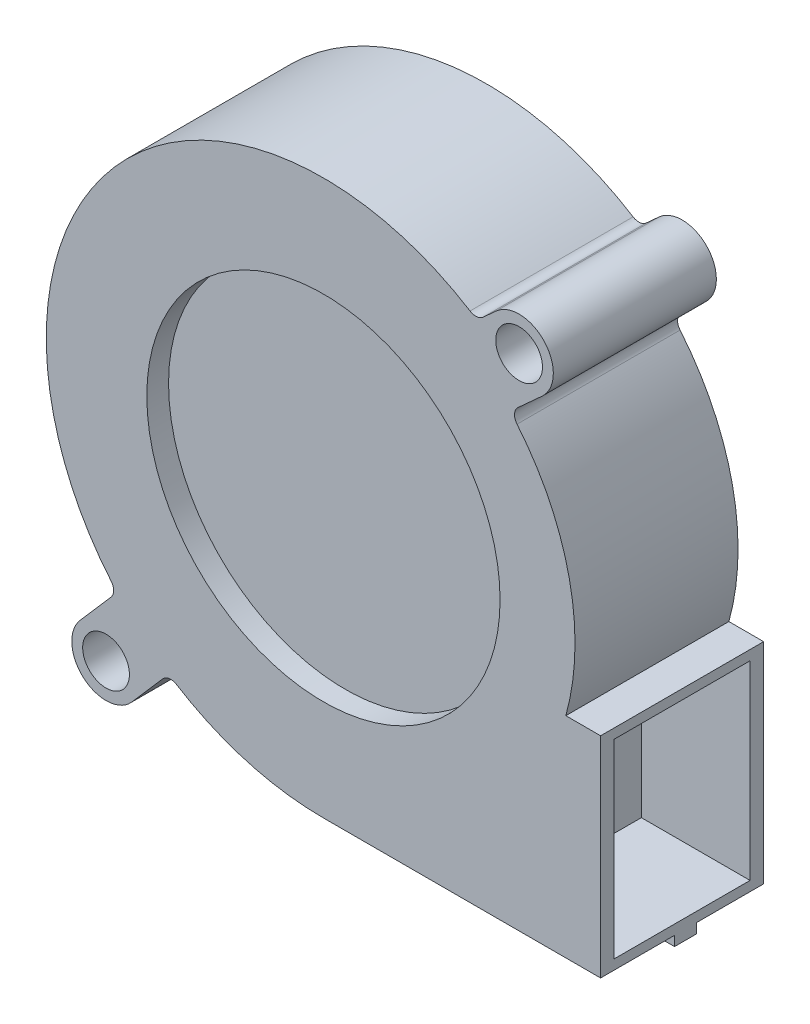
ISO-10303-21;
HEADER;
FILE_DESCRIPTION(('STEP AP214'),'2;1');
FILE_NAME('part.step','',(''),(''),'','','');
FILE_SCHEMA(('AUTOMOTIVE_DESIGN { 1 0 10303 214 1 1 1 1 }'));
ENDSEC;
DATA;
#1=APPLICATION_CONTEXT('core data for automotive mechanical design processes');
#2=APPLICATION_PROTOCOL_DEFINITION('international standard','automotive_design',2000,#1);
#3=PRODUCT_CONTEXT('',#1,'mechanical');
#4=PRODUCT('Part','Part','',(#3));
#5=PRODUCT_RELATED_PRODUCT_CATEGORY('part','',(#4));
#6=PRODUCT_DEFINITION_FORMATION('','',#4);
#7=PRODUCT_DEFINITION_CONTEXT('part definition',#1,'design');
#8=PRODUCT_DEFINITION('design','',#6,#7);
#9=PRODUCT_DEFINITION_SHAPE('','',#8);
#10=(LENGTH_UNIT() NAMED_UNIT(*) SI_UNIT(.MILLI.,.METRE.));
#11=(NAMED_UNIT(*) PLANE_ANGLE_UNIT() SI_UNIT($,.RADIAN.));
#12=(NAMED_UNIT(*) SI_UNIT($,.STERADIAN.) SOLID_ANGLE_UNIT());
#13=UNCERTAINTY_MEASURE_WITH_UNIT(LENGTH_MEASURE(1.E-05),#10,'distance_accuracy_value','');
#14=(GEOMETRIC_REPRESENTATION_CONTEXT(3) GLOBAL_UNCERTAINTY_ASSIGNED_CONTEXT((#13)) GLOBAL_UNIT_ASSIGNED_CONTEXT((#10,
#11,#12)) REPRESENTATION_CONTEXT('',''));
#15=CARTESIAN_POINT('',(0.,0.,0.));
#16=DIRECTION('',(0.,0.,1.));
#17=DIRECTION('',(1.,0.,0.));
#18=AXIS2_PLACEMENT_3D('',#15,#16,#17);
#19=CARTESIAN_POINT('',(-4.17823720879433,4.59639564959305,7.5));
#20=DIRECTION('',(0.67264597252616,-0.739964455662795,0.));
#21=DIRECTION('',(0.739964455662795,0.67264597252616,0.));
#22=AXIS2_PLACEMENT_3D('',#19,#20,#21);
#23=PLANE('',#22);
#24=DIRECTION('',(-0.739964455662795,-0.67264597252616,0.));
#25=VECTOR('',#24,1.);
#26=CARTESIAN_POINT('',(-4.17823720879433,4.59639564959305,-7.5));
#27=LINE('',#26,#25);
#28=CARTESIAN_POINT('',(15.8811651865426,22.8308880353378,-7.5));
#29=VERTEX_POINT('',#28);
#30=CARTESIAN_POINT('',(14.6907431403997,21.7487649835931,-7.5));
#31=VERTEX_POINT('',#30);
#32=EDGE_CURVE('E261',#29,#31,#27,.T.);
#33=ORIENTED_EDGE('',*,*,#32,.T.);
#34=DIRECTION('',(0.,0.,-1.));
#35=VECTOR('',#34,1.);
#36=CARTESIAN_POINT('',(14.6907431403997,21.7487649835931,7.5));
#37=LINE('',#36,#35);
#38=CARTESIAN_POINT('',(14.6907431403997,21.7487649835931,7.5));
#39=VERTEX_POINT('',#38);
#40=EDGE_CURVE('E11',#39,#31,#37,.T.);
#41=ORIENTED_EDGE('',*,*,#40,.F.);
#42=DIRECTION('',(-0.739964455662795,-0.67264597252616,0.));
#43=VECTOR('',#42,1.);
#44=CARTESIAN_POINT('',(-4.17823720879433,4.59639564959305,7.5));
#45=LINE('',#44,#43);
#46=CARTESIAN_POINT('',(15.8811651865426,22.8308880353378,7.5));
#47=VERTEX_POINT('',#46);
#48=EDGE_CURVE('E267',#47,#39,#45,.T.);
#49=ORIENTED_EDGE('',*,*,#48,.F.);
#50=DIRECTION('',(0.,0.,-1.));
#51=VECTOR('',#50,1.);
#52=CARTESIAN_POINT('',(15.8811651865426,22.8308880353378,7.5));
#53=LINE('',#52,#51);
#54=EDGE_CURVE('E310',#47,#29,#53,.T.);
#55=ORIENTED_EDGE('',*,*,#54,.T.);
#56=EDGE_LOOP('',(#33,#41,#49,#55));
#57=FACE_BOUND('',#56,.T.);
#58=ADVANCED_FACE('F35',(#57),#23,.F.);
#59=CARTESIAN_POINT('',(14.0180971678735,22.4887294392559,7.5));
#60=DIRECTION('',(0.,0.,-1.));
#61=DIRECTION('',(-1.,0.,0.));
#62=AXIS2_PLACEMENT_3D('',#59,#60,#61);
#63=CYLINDRICAL_SURFACE('',#62,0.999999999999999);
#64=CARTESIAN_POINT('',(14.0180971678735,22.4887294392559,-7.5));
#65=DIRECTION('',(0.,0.,1.));
#66=DIRECTION('',(1.,0.,0.));
#67=AXIS2_PLACEMENT_3D('',#64,#65,#66);
#68=CIRCLE('',#67,0.999999999999999);
#69=CARTESIAN_POINT('',(13.4891123690858,21.6400981396614,-7.5));
#70=VERTEX_POINT('',#69);
#71=EDGE_CURVE('E313',#31,#70,#68,.F.);
#72=ORIENTED_EDGE('',*,*,#71,.T.);
#73=DIRECTION('',(0.,0.,-1.));
#74=VECTOR('',#73,1.);
#75=CARTESIAN_POINT('',(13.4891123690858,21.6400981396614,7.5));
#76=LINE('',#75,#74);
#77=CARTESIAN_POINT('',(13.4891123690858,21.6400981396614,7.5));
#78=VERTEX_POINT('',#77);
#79=EDGE_CURVE('E42',#78,#70,#76,.T.);
#80=ORIENTED_EDGE('',*,*,#79,.F.);
#81=CARTESIAN_POINT('',(14.0180971678735,22.4887294392559,7.5));
#82=DIRECTION('',(0.,0.,1.));
#83=DIRECTION('',(1.,0.,0.));
#84=AXIS2_PLACEMENT_3D('',#81,#82,#83);
#85=CIRCLE('',#84,0.999999999999999);
#86=EDGE_CURVE('E270',#39,#78,#85,.F.);
#87=ORIENTED_EDGE('',*,*,#86,.F.);
#88=ORIENTED_EDGE('',*,*,#40,.T.);
#89=EDGE_LOOP('',(#72,#80,#87,#88));
#90=FACE_BOUND('',#89,.T.);
#91=ADVANCED_FACE('F415',(#90),#63,.F.);
#92=CARTESIAN_POINT('',(0.,0.,7.5));
#93=DIRECTION('',(0.,0.,-1.));
#94=DIRECTION('',(-1.,0.,0.));
#95=AXIS2_PLACEMENT_3D('',#92,#93,#94);
#96=CYLINDRICAL_SURFACE('',#95,25.5);
#97=CARTESIAN_POINT('',(0.,0.,-7.5));
#98=DIRECTION('',(0.,0.,1.));
#99=DIRECTION('',(1.,0.,0.));
#100=AXIS2_PLACEMENT_3D('',#97,#98,#99);
#101=CIRCLE('',#100,25.5);
#102=CARTESIAN_POINT('',(-19.5395415831544,-16.3846365452573,-7.5));
#103=VERTEX_POINT('',#102);
#104=EDGE_CURVE('E315',#70,#103,#101,.T.);
#105=ORIENTED_EDGE('',*,*,#104,.T.);
#106=DIRECTION('',(0.,0.,-1.));
#107=VECTOR('',#106,1.);
#108=CARTESIAN_POINT('',(-19.5395415831544,-16.3846365452573,7.5));
#109=LINE('',#108,#107);
#110=CARTESIAN_POINT('',(-19.5395415831544,-16.3846365452573,7.5));
#111=VERTEX_POINT('',#110);
#112=EDGE_CURVE('E388',#111,#103,#109,.T.);
#113=ORIENTED_EDGE('',*,*,#112,.F.);
#114=CARTESIAN_POINT('',(0.,0.,7.5));
#115=DIRECTION('',(0.,0.,1.));
#116=DIRECTION('',(1.,0.,0.));
#117=AXIS2_PLACEMENT_3D('',#114,#115,#116);
#118=CIRCLE('',#117,25.5);
#119=EDGE_CURVE('E273',#78,#111,#118,.T.);
#120=ORIENTED_EDGE('',*,*,#119,.F.);
#121=ORIENTED_EDGE('',*,*,#79,.T.);
#122=EDGE_LOOP('',(#105,#113,#120,#121));
#123=FACE_BOUND('',#122,.T.);
#124=ADVANCED_FACE('F395',(#123),#96,.T.);
#125=CARTESIAN_POINT('',(-20.3057981158271,-17.027171311738,7.5));
#126=DIRECTION('',(0.,0.,-1.));
#127=DIRECTION('',(-1.,0.,0.));
#128=AXIS2_PLACEMENT_3D('',#125,#126,#127);
#129=CYLINDRICAL_SURFACE('',#128,0.999999999999999);
#130=CARTESIAN_POINT('',(-20.3057981158271,-17.027171311738,-7.5));
#131=DIRECTION('',(0.,0.,1.));
#132=DIRECTION('',(1.,0.,0.));
#133=AXIS2_PLACEMENT_3D('',#130,#131,#132);
#134=CIRCLE('',#133,0.999999999999999);
#135=CARTESIAN_POINT('',(-19.5511925936636,-17.6833500266628,-7.5));
#136=VERTEX_POINT('',#135);
#137=EDGE_CURVE('E317',#103,#136,#134,.F.);
#138=ORIENTED_EDGE('',*,*,#137,.T.);
#139=DIRECTION('',(0.,0.,-1.));
#140=VECTOR('',#139,1.);
#141=CARTESIAN_POINT('',(-19.5511925936636,-17.6833500266628,7.5));
#142=LINE('',#141,#140);
#143=CARTESIAN_POINT('',(-19.5511925936636,-17.6833500266628,7.5));
#144=VERTEX_POINT('',#143);
#145=EDGE_CURVE('E386',#144,#136,#142,.T.);
#146=ORIENTED_EDGE('',*,*,#145,.F.);
#147=CARTESIAN_POINT('',(-20.3057981158271,-17.027171311738,7.5));
#148=DIRECTION('',(0.,0.,1.));
#149=DIRECTION('',(1.,0.,0.));
#150=AXIS2_PLACEMENT_3D('',#147,#148,#149);
#151=CIRCLE('',#150,0.999999999999999);
#152=EDGE_CURVE('E275',#111,#144,#151,.F.);
#153=ORIENTED_EDGE('',*,*,#152,.F.);
#154=ORIENTED_EDGE('',*,*,#112,.T.);
#155=EDGE_LOOP('',(#138,#146,#153,#154));
#156=FACE_BOUND('',#155,.T.);
#157=ADVANCED_FACE('F407',(#156),#129,.F.);
#158=CARTESIAN_POINT('',(-2.377007394815,2.06696295201305,7.5));
#159=DIRECTION('',(-0.754605522163504,0.656178714924788,0.));
#160=DIRECTION('',(-0.656178714924788,-0.754605522163504,0.));
#161=AXIS2_PLACEMENT_3D('',#158,#159,#160);
#162=PLANE('',#161);
#163=DIRECTION('',(0.656178714924788,0.754605522163504,0.));
#164=VECTOR('',#163,1.);
#165=CARTESIAN_POINT('',(-2.377007394815,2.06696295201305,-7.5));
#166=LINE('',#165,#164);
#167=CARTESIAN_POINT('',(-22.377007394815,-20.9330370479869,-7.5));
#168=VERTEX_POINT('',#167);
#169=EDGE_CURVE('E320',#168,#136,#166,.T.);
#170=ORIENTED_EDGE('',*,*,#169,.F.);
#171=DIRECTION('',(0.,0.,-1.));
#172=VECTOR('',#171,1.);
#173=CARTESIAN_POINT('',(-22.377007394815,-20.9330370479869,7.5));
#174=LINE('',#173,#172);
#175=CARTESIAN_POINT('',(-22.377007394815,-20.9330370479869,7.5));
#176=VERTEX_POINT('',#175);
#177=EDGE_CURVE('E384',#176,#168,#174,.T.);
#178=ORIENTED_EDGE('',*,*,#177,.F.);
#179=DIRECTION('',(0.656178714924788,0.754605522163504,0.));
#180=VECTOR('',#179,1.);
#181=CARTESIAN_POINT('',(-2.377007394815,2.06696295201305,7.5));
#182=LINE('',#181,#180);
#183=EDGE_CURVE('E277',#176,#144,#182,.T.);
#184=ORIENTED_EDGE('',*,*,#183,.T.);
#185=ORIENTED_EDGE('',*,*,#145,.T.);
#186=EDGE_LOOP('',(#170,#178,#184,#185));
#187=FACE_BOUND('',#186,.T.);
#188=ADVANCED_FACE('F470',(#187),#162,.T.);
#189=CARTESIAN_POINT('',(-20.,-23.,7.5));
#190=DIRECTION('',(0.,0.,-1.));
#191=DIRECTION('',(-1.,0.,0.));
#192=AXIS2_PLACEMENT_3D('',#189,#190,#191);
#193=CYLINDRICAL_SURFACE('',#192,3.15);
#194=CARTESIAN_POINT('',(-20.,-23.,-7.5));
#195=DIRECTION('',(0.,0.,1.));
#196=DIRECTION('',(1.,0.,0.));
#197=AXIS2_PLACEMENT_3D('',#194,#195,#196);
#198=CIRCLE('',#197,3.15);
#199=CARTESIAN_POINT('',(-17.622992605185,-25.0669629520131,-7.5));
#200=VERTEX_POINT('',#199);
#201=EDGE_CURVE('E323',#168,#200,#198,.T.);
#202=ORIENTED_EDGE('',*,*,#201,.T.);
#203=DIRECTION('',(0.,0.,-1.));
#204=VECTOR('',#203,1.);
#205=CARTESIAN_POINT('',(-17.622992605185,-25.0669629520131,7.5));
#206=LINE('',#205,#204);
#207=CARTESIAN_POINT('',(-17.622992605185,-25.0669629520131,7.5));
#208=VERTEX_POINT('',#207);
#209=EDGE_CURVE('E381',#208,#200,#206,.T.);
#210=ORIENTED_EDGE('',*,*,#209,.F.);
#211=CARTESIAN_POINT('',(-20.,-23.,7.5));
#212=DIRECTION('',(0.,0.,1.));
#213=DIRECTION('',(1.,0.,0.));
#214=AXIS2_PLACEMENT_3D('',#211,#212,#213);
#215=CIRCLE('',#214,3.15);
#216=EDGE_CURVE('E280',#176,#208,#215,.T.);
#217=ORIENTED_EDGE('',*,*,#216,.F.);
#218=ORIENTED_EDGE('',*,*,#177,.T.);
#219=EDGE_LOOP('',(#202,#210,#217,#218));
#220=FACE_BOUND('',#219,.T.);
#221=ADVANCED_FACE('F468',(#220),#193,.T.);
#222=CARTESIAN_POINT('',(2.37700739481505,-2.06696295201309,7.5));
#223=DIRECTION('',(-0.754605522163504,0.656178714924787,0.));
#224=DIRECTION('',(-0.656178714924787,-0.754605522163505,0.));
#225=AXIS2_PLACEMENT_3D('',#222,#223,#224);
#226=PLANE('',#225);
#227=DIRECTION('',(0.656178714924787,0.754605522163505,0.));
#228=VECTOR('',#227,1.);
#229=CARTESIAN_POINT('',(2.37700739481505,-2.06696295201309,-7.5));
#230=LINE('',#229,#228);
#231=CARTESIAN_POINT('',(-14.7971778040335,-21.8172759306889,-7.5));
#232=VERTEX_POINT('',#231);
#233=EDGE_CURVE('E325',#200,#232,#230,.T.);
#234=ORIENTED_EDGE('',*,*,#233,.T.);
#235=DIRECTION('',(0.,0.,-1.));
#236=VECTOR('',#235,1.);
#237=CARTESIAN_POINT('',(-14.7971778040335,-21.8172759306889,7.5));
#238=LINE('',#237,#236);
#239=CARTESIAN_POINT('',(-14.7971778040335,-21.8172759306889,7.5));
#240=VERTEX_POINT('',#239);
#241=EDGE_CURVE('E378',#240,#232,#238,.T.);
#242=ORIENTED_EDGE('',*,*,#241,.F.);
#243=DIRECTION('',(0.656178714924787,0.754605522163505,0.));
#244=VECTOR('',#243,1.);
#245=CARTESIAN_POINT('',(2.37700739481505,-2.06696295201309,7.5));
#246=LINE('',#245,#244);
#247=EDGE_CURVE('E282',#208,#240,#246,.T.);
#248=ORIENTED_EDGE('',*,*,#247,.F.);
#249=ORIENTED_EDGE('',*,*,#209,.T.);
#250=EDGE_LOOP('',(#234,#242,#248,#249));
#251=FACE_BOUND('',#250,.T.);
#252=ADVANCED_FACE('F464',(#251),#226,.F.);
#253=CARTESIAN_POINT('',(-14.04257228187,-22.4734546456137,7.5));
#254=DIRECTION('',(0.,0.,-1.));
#255=DIRECTION('',(-1.,0.,0.));
#256=AXIS2_PLACEMENT_3D('',#253,#254,#255);
#257=CYLINDRICAL_SURFACE('',#256,0.999999999999999);
#258=CARTESIAN_POINT('',(-14.04257228187,-22.4734546456137,-7.5));
#259=DIRECTION('',(0.,0.,1.));
#260=DIRECTION('',(1.,0.,0.));
#261=AXIS2_PLACEMENT_3D('',#258,#259,#260);
#262=CIRCLE('',#261,0.999999999999999);
#263=CARTESIAN_POINT('',(-13.5126638938749,-21.6253997533264,-7.5));
#264=VERTEX_POINT('',#263);
#265=EDGE_CURVE('E327',#232,#264,#262,.F.);
#266=ORIENTED_EDGE('',*,*,#265,.T.);
#267=DIRECTION('',(0.,0.,-1.));
#268=VECTOR('',#267,1.);
#269=CARTESIAN_POINT('',(-13.5126638938749,-21.6253997533264,7.5));
#270=LINE('',#269,#268);
#271=CARTESIAN_POINT('',(-13.5126638938749,-21.6253997533264,7.5));
#272=VERTEX_POINT('',#271);
#273=EDGE_CURVE('E375',#272,#264,#270,.T.);
#274=ORIENTED_EDGE('',*,*,#273,.F.);
#275=CARTESIAN_POINT('',(-14.04257228187,-22.4734546456137,7.5));
#276=DIRECTION('',(0.,0.,1.));
#277=DIRECTION('',(1.,0.,0.));
#278=AXIS2_PLACEMENT_3D('',#275,#276,#277);
#279=CIRCLE('',#278,0.999999999999999);
#280=EDGE_CURVE('E284',#240,#272,#279,.F.);
#281=ORIENTED_EDGE('',*,*,#280,.F.);
#282=ORIENTED_EDGE('',*,*,#241,.T.);
#283=EDGE_LOOP('',(#266,#274,#281,#282));
#284=FACE_BOUND('',#283,.T.);
#285=ADVANCED_FACE('F459',(#284),#257,.F.);
#286=CARTESIAN_POINT('',(0.,0.,7.5));
#287=DIRECTION('',(0.,0.,-1.));
#288=DIRECTION('',(-1.,0.,0.));
#289=AXIS2_PLACEMENT_3D('',#286,#287,#288);
#290=CYLINDRICAL_SURFACE('',#289,25.5);
#291=CARTESIAN_POINT('',(0.,0.,-7.5));
#292=DIRECTION('',(0.,0.,1.));
#293=DIRECTION('',(1.,0.,0.));
#294=AXIS2_PLACEMENT_3D('',#291,#292,#293);
#295=CIRCLE('',#294,25.5);
#296=CARTESIAN_POINT('',(0.,-25.5,-7.5));
#297=VERTEX_POINT('',#296);
#298=EDGE_CURVE('E329',#264,#297,#295,.T.);
#299=ORIENTED_EDGE('',*,*,#298,.T.);
#300=DIRECTION('',(0.,0.,-1.));
#301=VECTOR('',#300,1.);
#302=CARTESIAN_POINT('',(0.,-25.5,7.5));
#303=LINE('',#302,#301);
#304=CARTESIAN_POINT('',(0.,-25.5,7.5));
#305=VERTEX_POINT('',#304);
#306=EDGE_CURVE('E373',#305,#297,#303,.T.);
#307=ORIENTED_EDGE('',*,*,#306,.F.);
#308=CARTESIAN_POINT('',(0.,0.,7.5));
#309=DIRECTION('',(0.,0.,1.));
#310=DIRECTION('',(1.,0.,0.));
#311=AXIS2_PLACEMENT_3D('',#308,#309,#310);
#312=CIRCLE('',#311,25.5);
#313=EDGE_CURVE('E286',#272,#305,#312,.T.);
#314=ORIENTED_EDGE('',*,*,#313,.F.);
#315=ORIENTED_EDGE('',*,*,#273,.T.);
#316=EDGE_LOOP('',(#299,#307,#314,#315));
#317=FACE_BOUND('',#316,.T.);
#318=ADVANCED_FACE('F454',(#317),#290,.T.);
#319=CARTESIAN_POINT('',(0.,-25.5,7.5));
#320=DIRECTION('',(0.,-1.,0.));
#321=DIRECTION('',(1.,0.,0.));
#322=AXIS2_PLACEMENT_3D('',#319,#320,#321);
#323=PLANE('',#322);
#324=DIRECTION('',(1.,0.,0.));
#325=VECTOR('',#324,1.);
#326=CARTESIAN_POINT('',(14.1,-25.5,0.699999999999999));
#327=LINE('',#326,#325);
#328=CARTESIAN_POINT('',(14.1,-25.5,0.699999999999999));
#329=VERTEX_POINT('',#328);
#330=CARTESIAN_POINT('',(25.5,-25.5,0.699999999999999));
#331=VERTEX_POINT('',#330);
#332=EDGE_CURVE('E258',#329,#331,#327,.T.);
#333=ORIENTED_EDGE('',*,*,#332,.T.);
#334=DIRECTION('',(0.,0.,-1.));
#335=VECTOR('',#334,1.);
#336=CARTESIAN_POINT('',(25.5,-25.5,7.5));
#337=LINE('',#336,#335);
#338=CARTESIAN_POINT('',(25.5,-25.5,7.5));
#339=VERTEX_POINT('',#338);
#340=EDGE_CURVE('E370',#339,#331,#337,.T.);
#341=ORIENTED_EDGE('',*,*,#340,.F.);
#342=DIRECTION('',(-1.,0.,0.));
#343=VECTOR('',#342,1.);
#344=CARTESIAN_POINT('',(0.,-25.5,7.5));
#345=LINE('',#344,#343);
#346=EDGE_CURVE('E288',#339,#305,#345,.T.);
#347=ORIENTED_EDGE('',*,*,#346,.T.);
#348=ORIENTED_EDGE('',*,*,#306,.T.);
#349=DIRECTION('',(-1.,0.,0.));
#350=VECTOR('',#349,1.);
#351=CARTESIAN_POINT('',(0.,-25.5,-7.5));
#352=LINE('',#351,#350);
#353=CARTESIAN_POINT('',(25.5,-25.5,-7.5));
#354=VERTEX_POINT('',#353);
#355=EDGE_CURVE('E332',#354,#297,#352,.T.);
#356=ORIENTED_EDGE('',*,*,#355,.F.);
#357=CARTESIAN_POINT('',(25.5,-25.5,-1.3));
#358=VERTEX_POINT('',#357);
#359=EDGE_CURVE('E369',#358,#354,#337,.T.);
#360=ORIENTED_EDGE('',*,*,#359,.F.);
#361=DIRECTION('',(1.,0.,0.));
#362=VECTOR('',#361,1.);
#363=CARTESIAN_POINT('',(14.1,-25.5,-1.3));
#364=LINE('',#363,#362);
#365=CARTESIAN_POINT('',(14.1,-25.5,-1.3));
#366=VERTEX_POINT('',#365);
#367=EDGE_CURVE('E262',#366,#358,#364,.T.);
#368=ORIENTED_EDGE('',*,*,#367,.F.);
#369=DIRECTION('',(0.,0.,1.));
#370=VECTOR('',#369,1.);
#371=CARTESIAN_POINT('',(14.1,-25.5,0.699999999999999));
#372=LINE('',#371,#370);
#373=EDGE_CURVE('E249',#366,#329,#372,.T.);
#374=ORIENTED_EDGE('',*,*,#373,.T.);
#375=EDGE_LOOP('',(#333,#341,#347,#348,#356,#360,#368,#374));
#376=FACE_BOUND('',#375,.T.);
#377=ADVANCED_FACE('F449',(#376),#323,.T.);
#378=CARTESIAN_POINT('',(25.5,0.,7.5));
#379=DIRECTION('',(-1.,0.,0.));
#380=DIRECTION('',(0.,-1.,0.));
#381=AXIS2_PLACEMENT_3D('',#378,#379,#380);
#382=PLANE('',#381);
#383=DIRECTION('',(0.,0.,-1.));
#384=VECTOR('',#383,1.);
#385=CARTESIAN_POINT('',(25.5,-24.6,6.25));
#386=LINE('',#385,#384);
#387=CARTESIAN_POINT('',(25.5,-24.6,6.25));
#388=VERTEX_POINT('',#387);
#389=CARTESIAN_POINT('',(25.5,-24.6,-6.25));
#390=VERTEX_POINT('',#389);
#391=EDGE_CURVE('E225',#388,#390,#386,.T.);
#392=ORIENTED_EDGE('',*,*,#391,.F.);
#393=DIRECTION('',(0.,-1.,0.));
#394=VECTOR('',#393,1.);
#395=CARTESIAN_POINT('',(25.5,-7.09999999999999,6.25));
#396=LINE('',#395,#394);
#397=CARTESIAN_POINT('',(25.5,-7.09999999999999,6.25));
#398=VERTEX_POINT('',#397);
#399=EDGE_CURVE('E49',#398,#388,#396,.T.);
#400=ORIENTED_EDGE('',*,*,#399,.F.);
#401=DIRECTION('',(0.,0.,1.));
#402=VECTOR('',#401,1.);
#403=CARTESIAN_POINT('',(25.5,-7.09999999999999,6.25));
#404=LINE('',#403,#402);
#405=CARTESIAN_POINT('',(25.5,-7.09999999999999,-6.25));
#406=VERTEX_POINT('',#405);
#407=EDGE_CURVE('E216',#406,#398,#404,.T.);
#408=ORIENTED_EDGE('',*,*,#407,.F.);
#409=DIRECTION('',(0.,1.,0.));
#410=VECTOR('',#409,1.);
#411=CARTESIAN_POINT('',(25.5,-7.09999999999999,-6.25));
#412=LINE('',#411,#410);
#413=EDGE_CURVE('E219',#390,#406,#412,.T.);
#414=ORIENTED_EDGE('',*,*,#413,.F.);
#415=EDGE_LOOP('',(#392,#400,#408,#414));
#416=FACE_BOUND('',#415,.T.);
#417=DIRECTION('',(0.,1.,0.));
#418=VECTOR('',#417,1.);
#419=CARTESIAN_POINT('',(25.5,0.,-7.5));
#420=LINE('',#419,#418);
#421=CARTESIAN_POINT('',(25.5,-6.19999999999999,-7.5));
#422=VERTEX_POINT('',#421);
#423=EDGE_CURVE('E335',#354,#422,#420,.T.);
#424=ORIENTED_EDGE('',*,*,#423,.T.);
#425=DIRECTION('',(0.,0.,-1.));
#426=VECTOR('',#425,1.);
#427=CARTESIAN_POINT('',(25.5,-6.19999999999999,7.5));
#428=LINE('',#427,#426);
#429=CARTESIAN_POINT('',(25.5,-6.19999999999999,7.5));
#430=VERTEX_POINT('',#429);
#431=EDGE_CURVE('E366',#430,#422,#428,.T.);
#432=ORIENTED_EDGE('',*,*,#431,.F.);
#433=DIRECTION('',(0.,1.,0.));
#434=VECTOR('',#433,1.);
#435=CARTESIAN_POINT('',(25.5,0.,7.5));
#436=LINE('',#435,#434);
#437=EDGE_CURVE('E291',#339,#430,#436,.T.);
#438=ORIENTED_EDGE('',*,*,#437,.F.);
#439=ORIENTED_EDGE('',*,*,#340,.T.);
#440=DIRECTION('',(0.,-1.,0.));
#441=VECTOR('',#440,1.);
#442=CARTESIAN_POINT('',(25.5,-25.5,0.699999999999999));
#443=LINE('',#442,#441);
#444=CARTESIAN_POINT('',(25.5,-26.4,0.699999999999999));
#445=VERTEX_POINT('',#444);
#446=EDGE_CURVE('E238',#331,#445,#443,.T.);
#447=ORIENTED_EDGE('',*,*,#446,.T.);
#448=DIRECTION('',(0.,0.,-1.));
#449=VECTOR('',#448,1.);
#450=CARTESIAN_POINT('',(25.5,-26.4,0.699999999999999));
#451=LINE('',#450,#449);
#452=CARTESIAN_POINT('',(25.5,-26.4,-1.3));
#453=VERTEX_POINT('',#452);
#454=EDGE_CURVE('E255',#445,#453,#451,.T.);
#455=ORIENTED_EDGE('',*,*,#454,.T.);
#456=DIRECTION('',(0.,1.,0.));
#457=VECTOR('',#456,1.);
#458=CARTESIAN_POINT('',(25.5,-25.5,-1.3));
#459=LINE('',#458,#457);
#460=EDGE_CURVE('E57',#453,#358,#459,.T.);
#461=ORIENTED_EDGE('',*,*,#460,.T.);
#462=ORIENTED_EDGE('',*,*,#359,.T.);
#463=EDGE_LOOP('',(#424,#432,#438,#439,#447,#455,#461,#462));
#464=FACE_BOUND('',#463,.T.);
#465=ADVANCED_FACE('F443',(#416,#464),#382,.F.);
#466=CARTESIAN_POINT('',(0.,-6.19999999999999,7.5));
#467=DIRECTION('',(0.,-1.,0.));
#468=DIRECTION('',(1.,0.,0.));
#469=AXIS2_PLACEMENT_3D('',#466,#467,#468);
#470=PLANE('',#469);
#471=DIRECTION('',(-1.,0.,0.));
#472=VECTOR('',#471,1.);
#473=CARTESIAN_POINT('',(0.,-6.19999999999999,-7.5));
#474=LINE('',#473,#472);
#475=CARTESIAN_POINT('',(22.3,-6.19999999999999,-7.5));
#476=VERTEX_POINT('',#475);
#477=EDGE_CURVE('E337',#422,#476,#474,.T.);
#478=ORIENTED_EDGE('',*,*,#477,.T.);
#479=DIRECTION('',(0.,0.,-1.));
#480=VECTOR('',#479,1.);
#481=CARTESIAN_POINT('',(22.3,-6.19999999999999,7.5));
#482=LINE('',#481,#480);
#483=CARTESIAN_POINT('',(22.3,-6.19999999999999,7.5));
#484=VERTEX_POINT('',#483);
#485=EDGE_CURVE('E363',#484,#476,#482,.T.);
#486=ORIENTED_EDGE('',*,*,#485,.F.);
#487=DIRECTION('',(-1.,0.,0.));
#488=VECTOR('',#487,1.);
#489=CARTESIAN_POINT('',(0.,-6.19999999999999,7.5));
#490=LINE('',#489,#488);
#491=EDGE_CURVE('E293',#430,#484,#490,.T.);
#492=ORIENTED_EDGE('',*,*,#491,.F.);
#493=ORIENTED_EDGE('',*,*,#431,.T.);
#494=EDGE_LOOP('',(#478,#486,#492,#493));
#495=FACE_BOUND('',#494,.T.);
#496=ADVANCED_FACE('F440',(#495),#470,.F.);
#497=CARTESIAN_POINT('',(0.,0.,7.5));
#498=DIRECTION('',(0.,0.,-1.));
#499=DIRECTION('',(-1.,0.,0.));
#500=AXIS2_PLACEMENT_3D('',#497,#498,#499);
#501=CYLINDRICAL_SURFACE('',#500,23.1458419591943);
#502=CARTESIAN_POINT('',(0.,0.,-7.5));
#503=DIRECTION('',(0.,0.,1.));
#504=DIRECTION('',(1.,0.,0.));
#505=AXIS2_PLACEMENT_3D('',#502,#503,#504);
#506=CIRCLE('',#505,23.1458419591943);
#507=CARTESIAN_POINT('',(17.81145238904,14.781142168079,-7.5));
#508=VERTEX_POINT('',#507);
#509=EDGE_CURVE('E339',#476,#508,#506,.T.);
#510=ORIENTED_EDGE('',*,*,#509,.T.);
#511=DIRECTION('',(0.,0.,-1.));
#512=VECTOR('',#511,1.);
#513=CARTESIAN_POINT('',(17.81145238904,14.781142168079,7.5));
#514=LINE('',#513,#512);
#515=CARTESIAN_POINT('',(17.81145238904,14.781142168079,7.5));
#516=VERTEX_POINT('',#515);
#517=EDGE_CURVE('E360',#516,#508,#514,.T.);
#518=ORIENTED_EDGE('',*,*,#517,.F.);
#519=CARTESIAN_POINT('',(0.,0.,7.5));
#520=DIRECTION('',(0.,0.,1.));
#521=DIRECTION('',(1.,0.,0.));
#522=AXIS2_PLACEMENT_3D('',#519,#520,#521);
#523=CIRCLE('',#522,23.1458419591943);
#524=EDGE_CURVE('E295',#484,#516,#523,.T.);
#525=ORIENTED_EDGE('',*,*,#524,.F.);
#526=ORIENTED_EDGE('',*,*,#485,.T.);
#527=EDGE_LOOP('',(#510,#518,#525,#526));
#528=FACE_BOUND('',#527,.T.);
#529=ADVANCED_FACE('F435',(#528),#501,.T.);
#530=CARTESIAN_POINT('',(18.5809837986314,15.419751132667,7.5));
#531=DIRECTION('',(0.,0.,-1.));
#532=DIRECTION('',(-1.,0.,0.));
#533=AXIS2_PLACEMENT_3D('',#530,#531,#532);
#534=CYLINDRICAL_SURFACE('',#533,0.999999999999999);
#535=CARTESIAN_POINT('',(18.5809837986314,15.419751132667,-7.5));
#536=DIRECTION('',(0.,0.,1.));
#537=DIRECTION('',(1.,0.,0.));
#538=AXIS2_PLACEMENT_3D('',#535,#536,#537);
#539=CIRCLE('',#538,0.999999999999999);
#540=CARTESIAN_POINT('',(17.9083378261053,16.1597155883298,-7.5));
#541=VERTEX_POINT('',#540);
#542=EDGE_CURVE('E341',#508,#541,#539,.F.);
#543=ORIENTED_EDGE('',*,*,#542,.T.);
#544=DIRECTION('',(0.,0.,-1.));
#545=VECTOR('',#544,1.);
#546=CARTESIAN_POINT('',(17.9083378261053,16.1597155883298,7.5));
#547=LINE('',#546,#545);
#548=CARTESIAN_POINT('',(17.9083378261053,16.1597155883298,7.5));
#549=VERTEX_POINT('',#548);
#550=EDGE_CURVE('E358',#549,#541,#547,.T.);
#551=ORIENTED_EDGE('',*,*,#550,.F.);
#552=CARTESIAN_POINT('',(18.5809837986314,15.419751132667,7.5));
#553=DIRECTION('',(0.,0.,1.));
#554=DIRECTION('',(1.,0.,0.));
#555=AXIS2_PLACEMENT_3D('',#552,#553,#554);
#556=CIRCLE('',#555,0.999999999999999);
#557=EDGE_CURVE('E297',#516,#549,#556,.F.);
#558=ORIENTED_EDGE('',*,*,#557,.F.);
#559=ORIENTED_EDGE('',*,*,#517,.T.);
#560=EDGE_LOOP('',(#543,#551,#558,#559));
#561=FACE_BOUND('',#560,.T.);
#562=ADVANCED_FACE('F429',(#561),#534,.F.);
#563=CARTESIAN_POINT('',(0.0594324181204341,-0.0653804210825041,7.5));
#564=DIRECTION('',(0.672645972526158,-0.739964455662796,0.));
#565=DIRECTION('',(0.739964455662796,0.672645972526158,0.));
#566=AXIS2_PLACEMENT_3D('',#563,#564,#565);
#567=PLANE('',#566);
#568=DIRECTION('',(-0.739964455662796,-0.672645972526158,0.));
#569=VECTOR('',#568,1.);
#570=CARTESIAN_POINT('',(0.0594324181204341,-0.0653804210825041,-7.5));
#571=LINE('',#570,#569);
#572=CARTESIAN_POINT('',(20.1188348134574,18.1691119646622,-7.5));
#573=VERTEX_POINT('',#572);
#574=EDGE_CURVE('E344',#573,#541,#571,.T.);
#575=ORIENTED_EDGE('',*,*,#574,.F.);
#576=DIRECTION('',(0.,0.,-1.));
#577=VECTOR('',#576,1.);
#578=CARTESIAN_POINT('',(20.1188348134574,18.1691119646622,7.5));
#579=LINE('',#578,#577);
#580=CARTESIAN_POINT('',(20.1188348134574,18.1691119646622,7.5));
#581=VERTEX_POINT('',#580);
#582=EDGE_CURVE('E356',#581,#573,#579,.T.);
#583=ORIENTED_EDGE('',*,*,#582,.F.);
#584=DIRECTION('',(-0.739964455662796,-0.672645972526158,0.));
#585=VECTOR('',#584,1.);
#586=CARTESIAN_POINT('',(0.0594324181204341,-0.0653804210825041,7.5));
#587=LINE('',#586,#585);
#588=EDGE_CURVE('E299',#581,#549,#587,.T.);
#589=ORIENTED_EDGE('',*,*,#588,.T.);
#590=ORIENTED_EDGE('',*,*,#550,.T.);
#591=EDGE_LOOP('',(#575,#583,#589,#590));
#592=FACE_BOUND('',#591,.T.);
#593=ADVANCED_FACE('F423',(#592),#567,.T.);
#594=CARTESIAN_POINT('',(18.,20.5,7.5));
#595=DIRECTION('',(0.,0.,-1.));
#596=DIRECTION('',(-1.,0.,0.));
#597=AXIS2_PLACEMENT_3D('',#594,#595,#596);
#598=CYLINDRICAL_SURFACE('',#597,2.15);
#599=CARTESIAN_POINT('',(18.,20.5,7.5));
#600=DIRECTION('',(0.,0.,1.));
#601=DIRECTION('',(1.,0.,0.));
#602=AXIS2_PLACEMENT_3D('',#599,#600,#601);
#603=CIRCLE('',#602,2.15);
#604=CARTESIAN_POINT('',(20.15,20.5,7.5));
#605=VERTEX_POINT('',#604);
#606=EDGE_CURVE('E304',#605,#605,#603,.T.);
#607=ORIENTED_EDGE('',*,*,#606,.T.);
#608=EDGE_LOOP('',(#607));
#609=FACE_BOUND('',#608,.T.);
#610=CARTESIAN_POINT('',(18.,20.5,-7.5));
#611=DIRECTION('',(0.,0.,1.));
#612=DIRECTION('',(1.,0.,0.));
#613=AXIS2_PLACEMENT_3D('',#610,#611,#612);
#614=CIRCLE('',#613,2.15);
#615=CARTESIAN_POINT('',(20.15,20.5,-7.5));
#616=VERTEX_POINT('',#615);
#617=EDGE_CURVE('E349',#616,#616,#614,.T.);
#618=ORIENTED_EDGE('',*,*,#617,.F.);
#619=EDGE_LOOP('',(#618));
#620=FACE_BOUND('',#619,.T.);
#621=ADVANCED_FACE('F565',(#609,#620),#598,.F.);
#622=CARTESIAN_POINT('',(18.,20.5,7.5));
#623=DIRECTION('',(0.,0.,-1.));
#624=DIRECTION('',(-1.,0.,0.));
#625=AXIS2_PLACEMENT_3D('',#622,#623,#624);
#626=CYLINDRICAL_SURFACE('',#625,3.15);
#627=CARTESIAN_POINT('',(18.,20.5,-7.5));
#628=DIRECTION('',(0.,0.,1.));
#629=DIRECTION('',(1.,0.,0.));
#630=AXIS2_PLACEMENT_3D('',#627,#628,#629);
#631=CIRCLE('',#630,3.15);
#632=EDGE_CURVE('E347',#573,#29,#631,.T.);
#633=ORIENTED_EDGE('',*,*,#632,.T.);
#634=ORIENTED_EDGE('',*,*,#54,.F.);
#635=CARTESIAN_POINT('',(18.,20.5,7.5));
#636=DIRECTION('',(0.,0.,1.));
#637=DIRECTION('',(1.,0.,0.));
#638=AXIS2_PLACEMENT_3D('',#635,#636,#637);
#639=CIRCLE('',#638,3.15);
#640=EDGE_CURVE('E302',#581,#47,#639,.T.);
#641=ORIENTED_EDGE('',*,*,#640,.F.);
#642=ORIENTED_EDGE('',*,*,#582,.T.);
#643=EDGE_LOOP('',(#633,#634,#641,#642));
#644=FACE_BOUND('',#643,.T.);
#645=ADVANCED_FACE('F574',(#644),#626,.T.);
#646=CARTESIAN_POINT('',(-20.,-23.,7.5));
#647=DIRECTION('',(0.,0.,-1.));
#648=DIRECTION('',(-1.,0.,0.));
#649=AXIS2_PLACEMENT_3D('',#646,#647,#648);
#650=CYLINDRICAL_SURFACE('',#649,2.15);
#651=CARTESIAN_POINT('',(-20.,-23.,7.5));
#652=DIRECTION('',(0.,0.,1.));
#653=DIRECTION('',(1.,0.,0.));
#654=AXIS2_PLACEMENT_3D('',#651,#652,#653);
#655=CIRCLE('',#654,2.15);
#656=CARTESIAN_POINT('',(-17.85,-23.,7.5));
#657=VERTEX_POINT('',#656);
#658=EDGE_CURVE('E307',#657,#657,#655,.T.);
#659=ORIENTED_EDGE('',*,*,#658,.T.);
#660=EDGE_LOOP('',(#659));
#661=FACE_BOUND('',#660,.T.);
#662=CARTESIAN_POINT('',(-20.,-23.,-7.5));
#663=DIRECTION('',(0.,0.,1.));
#664=DIRECTION('',(1.,0.,0.));
#665=AXIS2_PLACEMENT_3D('',#662,#663,#664);
#666=CIRCLE('',#665,2.15);
#667=CARTESIAN_POINT('',(-17.85,-23.,-7.5));
#668=VERTEX_POINT('',#667);
#669=EDGE_CURVE('E271',#668,#668,#666,.T.);
#670=ORIENTED_EDGE('',*,*,#669,.F.);
#671=EDGE_LOOP('',(#670));
#672=FACE_BOUND('',#671,.T.);
#673=ADVANCED_FACE('F584',(#661,#672),#650,.F.);
#674=CARTESIAN_POINT('',(0.,0.,7.5));
#675=DIRECTION('',(0.,0.,1.));
#676=DIRECTION('',(1.,0.,0.));
#677=AXIS2_PLACEMENT_3D('',#674,#675,#676);
#678=PLANE('',#677);
#679=CARTESIAN_POINT('',(0.,0.,7.5));
#680=DIRECTION('',(0.,0.,1.));
#681=DIRECTION('',(1.,0.,0.));
#682=AXIS2_PLACEMENT_3D('',#679,#680,#681);
#683=CIRCLE('',#682,16.25);
#684=CARTESIAN_POINT('',(16.25,0.,7.5));
#685=VERTEX_POINT('',#684);
#686=EDGE_CURVE('E231',#685,#685,#683,.T.);
#687=ORIENTED_EDGE('',*,*,#686,.F.);
#688=EDGE_LOOP('',(#687));
#689=FACE_BOUND('',#688,.T.);
#690=ORIENTED_EDGE('',*,*,#48,.T.);
#691=ORIENTED_EDGE('',*,*,#86,.T.);
#692=ORIENTED_EDGE('',*,*,#119,.T.);
#693=ORIENTED_EDGE('',*,*,#152,.T.);
#694=ORIENTED_EDGE('',*,*,#183,.F.);
#695=ORIENTED_EDGE('',*,*,#216,.T.);
#696=ORIENTED_EDGE('',*,*,#247,.T.);
#697=ORIENTED_EDGE('',*,*,#280,.T.);
#698=ORIENTED_EDGE('',*,*,#313,.T.);
#699=ORIENTED_EDGE('',*,*,#346,.F.);
#700=ORIENTED_EDGE('',*,*,#437,.T.);
#701=ORIENTED_EDGE('',*,*,#491,.T.);
#702=ORIENTED_EDGE('',*,*,#524,.T.);
#703=ORIENTED_EDGE('',*,*,#557,.T.);
#704=ORIENTED_EDGE('',*,*,#588,.F.);
#705=ORIENTED_EDGE('',*,*,#640,.T.);
#706=EDGE_LOOP('',(#690,#691,#692,#693,#694,#695,#696,#697,#698,#699,#700,#701,#702,#703,#704,#705));
#707=FACE_BOUND('',#706,.T.);
#708=ORIENTED_EDGE('',*,*,#606,.F.);
#709=EDGE_LOOP('',(#708));
#710=FACE_BOUND('',#709,.T.);
#711=ORIENTED_EDGE('',*,*,#658,.F.);
#712=EDGE_LOOP('',(#711));
#713=FACE_BOUND('',#712,.T.);
#714=ADVANCED_FACE('F411',(#689,#707,#710,#713),#678,.T.);
#715=CARTESIAN_POINT('',(0.,0.,-7.5));
#716=DIRECTION('',(0.,0.,1.));
#717=DIRECTION('',(1.,0.,0.));
#718=AXIS2_PLACEMENT_3D('',#715,#716,#717);
#719=PLANE('',#718);
#720=ORIENTED_EDGE('',*,*,#32,.F.);
#721=ORIENTED_EDGE('',*,*,#632,.F.);
#722=ORIENTED_EDGE('',*,*,#574,.T.);
#723=ORIENTED_EDGE('',*,*,#542,.F.);
#724=ORIENTED_EDGE('',*,*,#509,.F.);
#725=ORIENTED_EDGE('',*,*,#477,.F.);
#726=ORIENTED_EDGE('',*,*,#423,.F.);
#727=ORIENTED_EDGE('',*,*,#355,.T.);
#728=ORIENTED_EDGE('',*,*,#298,.F.);
#729=ORIENTED_EDGE('',*,*,#265,.F.);
#730=ORIENTED_EDGE('',*,*,#233,.F.);
#731=ORIENTED_EDGE('',*,*,#201,.F.);
#732=ORIENTED_EDGE('',*,*,#169,.T.);
#733=ORIENTED_EDGE('',*,*,#137,.F.);
#734=ORIENTED_EDGE('',*,*,#104,.F.);
#735=ORIENTED_EDGE('',*,*,#71,.F.);
#736=EDGE_LOOP('',(#720,#721,#722,#723,#724,#725,#726,#727,#728,#729,#730,#731,#732,#733,#734,#735));
#737=FACE_BOUND('',#736,.T.);
#738=ORIENTED_EDGE('',*,*,#617,.T.);
#739=EDGE_LOOP('',(#738));
#740=FACE_BOUND('',#739,.T.);
#741=ORIENTED_EDGE('',*,*,#669,.T.);
#742=EDGE_LOOP('',(#741));
#743=FACE_BOUND('',#742,.T.);
#744=ADVANCED_FACE('F401',(#737,#740,#743),#719,.F.);
#745=CARTESIAN_POINT('',(14.1,-25.5,0.699999999999999));
#746=DIRECTION('',(0.,0.,1.));
#747=DIRECTION('',(0.,-1.,0.));
#748=AXIS2_PLACEMENT_3D('',#745,#746,#747);
#749=PLANE('',#748);
#750=ORIENTED_EDGE('',*,*,#446,.F.);
#751=ORIENTED_EDGE('',*,*,#332,.F.);
#752=DIRECTION('',(0.,-1.,0.));
#753=VECTOR('',#752,1.);
#754=CARTESIAN_POINT('',(14.1,-25.5,0.699999999999999));
#755=LINE('',#754,#753);
#756=CARTESIAN_POINT('',(14.1,-26.4,0.699999999999999));
#757=VERTEX_POINT('',#756);
#758=EDGE_CURVE('E241',#329,#757,#755,.T.);
#759=ORIENTED_EDGE('',*,*,#758,.T.);
#760=DIRECTION('',(1.,0.,0.));
#761=VECTOR('',#760,1.);
#762=CARTESIAN_POINT('',(14.1,-26.4,0.699999999999999));
#763=LINE('',#762,#761);
#764=EDGE_CURVE('E252',#757,#445,#763,.T.);
#765=ORIENTED_EDGE('',*,*,#764,.T.);
#766=EDGE_LOOP('',(#750,#751,#759,#765));
#767=FACE_BOUND('',#766,.T.);
#768=ADVANCED_FACE('F604',(#767),#749,.T.);
#769=CARTESIAN_POINT('',(14.1,-25.5,-1.3));
#770=DIRECTION('',(0.,0.,-1.));
#771=DIRECTION('',(0.,1.,0.));
#772=AXIS2_PLACEMENT_3D('',#769,#770,#771);
#773=PLANE('',#772);
#774=ORIENTED_EDGE('',*,*,#460,.F.);
#775=DIRECTION('',(1.,0.,0.));
#776=VECTOR('',#775,1.);
#777=CARTESIAN_POINT('',(14.1,-26.4,-1.3));
#778=LINE('',#777,#776);
#779=CARTESIAN_POINT('',(14.1,-26.4,-1.3));
#780=VERTEX_POINT('',#779);
#781=EDGE_CURVE('E264',#780,#453,#778,.T.);
#782=ORIENTED_EDGE('',*,*,#781,.F.);
#783=DIRECTION('',(0.,1.,0.));
#784=VECTOR('',#783,1.);
#785=CARTESIAN_POINT('',(14.1,-25.5,-1.3));
#786=LINE('',#785,#784);
#787=EDGE_CURVE('E247',#780,#366,#786,.T.);
#788=ORIENTED_EDGE('',*,*,#787,.T.);
#789=ORIENTED_EDGE('',*,*,#367,.T.);
#790=EDGE_LOOP('',(#774,#782,#788,#789));
#791=FACE_BOUND('',#790,.T.);
#792=ADVANCED_FACE('F621',(#791),#773,.T.);
#793=CARTESIAN_POINT('',(14.1,-26.4,0.699999999999999));
#794=DIRECTION('',(0.,-1.,0.));
#795=DIRECTION('',(1.,0.,0.));
#796=AXIS2_PLACEMENT_3D('',#793,#794,#795);
#797=PLANE('',#796);
#798=ORIENTED_EDGE('',*,*,#454,.F.);
#799=ORIENTED_EDGE('',*,*,#764,.F.);
#800=DIRECTION('',(0.,0.,-1.));
#801=VECTOR('',#800,1.);
#802=CARTESIAN_POINT('',(14.1,-26.4,0.699999999999999));
#803=LINE('',#802,#801);
#804=EDGE_CURVE('E244',#757,#780,#803,.T.);
#805=ORIENTED_EDGE('',*,*,#804,.T.);
#806=ORIENTED_EDGE('',*,*,#781,.T.);
#807=EDGE_LOOP('',(#798,#799,#805,#806));
#808=FACE_BOUND('',#807,.T.);
#809=ADVANCED_FACE('F631',(#808),#797,.T.);
#810=CARTESIAN_POINT('',(14.1,0.,0.));
#811=DIRECTION('',(1.,0.,0.));
#812=DIRECTION('',(0.,0.,-1.));
#813=AXIS2_PLACEMENT_3D('',#810,#811,#812);
#814=PLANE('',#813);
#815=ORIENTED_EDGE('',*,*,#758,.F.);
#816=ORIENTED_EDGE('',*,*,#373,.F.);
#817=ORIENTED_EDGE('',*,*,#787,.F.);
#818=ORIENTED_EDGE('',*,*,#804,.F.);
#819=EDGE_LOOP('',(#815,#816,#817,#818));
#820=FACE_BOUND('',#819,.T.);
#821=ADVANCED_FACE('F641',(#820),#814,.F.);
#822=CARTESIAN_POINT('',(0.,0.,5.5));
#823=DIRECTION('',(0.,0.,1.));
#824=DIRECTION('',(1.,0.,0.));
#825=AXIS2_PLACEMENT_3D('',#822,#823,#824);
#826=CYLINDRICAL_SURFACE('',#825,16.25);
#827=CARTESIAN_POINT('',(0.,0.,5.5));
#828=DIRECTION('',(0.,0.,1.));
#829=DIRECTION('',(1.,0.,0.));
#830=AXIS2_PLACEMENT_3D('',#827,#828,#829);
#831=CIRCLE('',#830,16.25);
#832=CARTESIAN_POINT('',(16.25,0.,5.5));
#833=VERTEX_POINT('',#832);
#834=EDGE_CURVE('E235',#833,#833,#831,.T.);
#835=ORIENTED_EDGE('',*,*,#834,.F.);
#836=EDGE_LOOP('',(#835));
#837=FACE_BOUND('',#836,.T.);
#838=ORIENTED_EDGE('',*,*,#686,.T.);
#839=EDGE_LOOP('',(#838));
#840=FACE_BOUND('',#839,.T.);
#841=ADVANCED_FACE('F651',(#837,#840),#826,.F.);
#842=CARTESIAN_POINT('',(0.,0.,5.5));
#843=DIRECTION('',(0.,0.,1.));
#844=DIRECTION('',(1.,0.,0.));
#845=AXIS2_PLACEMENT_3D('',#842,#843,#844);
#846=PLANE('',#845);
#847=ORIENTED_EDGE('',*,*,#834,.T.);
#848=EDGE_LOOP('',(#847));
#849=FACE_BOUND('',#848,.T.);
#850=ADVANCED_FACE('F671',(#849),#846,.T.);
#851=CARTESIAN_POINT('',(15.5,-7.09999999999999,6.25));
#852=DIRECTION('',(0.,0.,1.));
#853=DIRECTION('',(0.,-1.,0.));
#854=AXIS2_PLACEMENT_3D('',#851,#852,#853);
#855=PLANE('',#854);
#856=ORIENTED_EDGE('',*,*,#399,.T.);
#857=DIRECTION('',(1.,0.,0.));
#858=VECTOR('',#857,1.);
#859=CARTESIAN_POINT('',(15.5,-24.6,6.25));
#860=LINE('',#859,#858);
#861=CARTESIAN_POINT('',(15.5,-24.6,6.25));
#862=VERTEX_POINT('',#861);
#863=EDGE_CURVE('E194',#862,#388,#860,.T.);
#864=ORIENTED_EDGE('',*,*,#863,.F.);
#865=DIRECTION('',(0.,-1.,0.));
#866=VECTOR('',#865,1.);
#867=CARTESIAN_POINT('',(15.5,-7.09999999999999,6.25));
#868=LINE('',#867,#866);
#869=CARTESIAN_POINT('',(15.5,-7.09999999999999,6.25));
#870=VERTEX_POINT('',#869);
#871=EDGE_CURVE('E198',#870,#862,#868,.T.);
#872=ORIENTED_EDGE('',*,*,#871,.F.);
#873=DIRECTION('',(1.,0.,0.));
#874=VECTOR('',#873,1.);
#875=CARTESIAN_POINT('',(15.5,-7.09999999999999,6.25));
#876=LINE('',#875,#874);
#877=EDGE_CURVE('E229',#870,#398,#876,.T.);
#878=ORIENTED_EDGE('',*,*,#877,.T.);
#879=EDGE_LOOP('',(#856,#864,#872,#878));
#880=FACE_BOUND('',#879,.T.);
#881=ADVANCED_FACE('F196',(#880),#855,.F.);
#882=CARTESIAN_POINT('',(15.5,-7.09999999999999,6.25));
#883=DIRECTION('',(0.,1.,0.));
#884=DIRECTION('',(-1.,0.,0.));
#885=AXIS2_PLACEMENT_3D('',#882,#883,#884);
#886=PLANE('',#885);
#887=ORIENTED_EDGE('',*,*,#407,.T.);
#888=ORIENTED_EDGE('',*,*,#877,.F.);
#889=DIRECTION('',(0.,0.,1.));
#890=VECTOR('',#889,1.);
#891=CARTESIAN_POINT('',(15.5,-7.09999999999999,6.25));
#892=LINE('',#891,#890);
#893=CARTESIAN_POINT('',(15.5,-7.09999999999999,-6.25));
#894=VERTEX_POINT('',#893);
#895=EDGE_CURVE('E204',#894,#870,#892,.T.);
#896=ORIENTED_EDGE('',*,*,#895,.F.);
#897=DIRECTION('',(1.,0.,0.));
#898=VECTOR('',#897,1.);
#899=CARTESIAN_POINT('',(15.5,-7.09999999999999,-6.25));
#900=LINE('',#899,#898);
#901=EDGE_CURVE('E232',#894,#406,#900,.T.);
#902=ORIENTED_EDGE('',*,*,#901,.T.);
#903=EDGE_LOOP('',(#887,#888,#896,#902));
#904=FACE_BOUND('',#903,.T.);
#905=ADVANCED_FACE('F697',(#904),#886,.F.);
#906=CARTESIAN_POINT('',(15.5,-7.09999999999999,-6.25));
#907=DIRECTION('',(0.,0.,-1.));
#908=DIRECTION('',(0.,1.,0.));
#909=AXIS2_PLACEMENT_3D('',#906,#907,#908);
#910=PLANE('',#909);
#911=ORIENTED_EDGE('',*,*,#413,.T.);
#912=ORIENTED_EDGE('',*,*,#901,.F.);
#913=DIRECTION('',(0.,1.,0.));
#914=VECTOR('',#913,1.);
#915=CARTESIAN_POINT('',(15.5,-7.09999999999999,-6.25));
#916=LINE('',#915,#914);
#917=CARTESIAN_POINT('',(15.5,-24.6,-6.25));
#918=VERTEX_POINT('',#917);
#919=EDGE_CURVE('E212',#918,#894,#916,.T.);
#920=ORIENTED_EDGE('',*,*,#919,.F.);
#921=DIRECTION('',(1.,0.,0.));
#922=VECTOR('',#921,1.);
#923=CARTESIAN_POINT('',(15.5,-24.6,-6.25));
#924=LINE('',#923,#922);
#925=EDGE_CURVE('E203',#918,#390,#924,.T.);
#926=ORIENTED_EDGE('',*,*,#925,.T.);
#927=EDGE_LOOP('',(#911,#912,#920,#926));
#928=FACE_BOUND('',#927,.T.);
#929=ADVANCED_FACE('F706',(#928),#910,.F.);
#930=CARTESIAN_POINT('',(15.5,-24.6,6.25));
#931=DIRECTION('',(0.,-1.,0.));
#932=DIRECTION('',(1.,0.,0.));
#933=AXIS2_PLACEMENT_3D('',#930,#931,#932);
#934=PLANE('',#933);
#935=ORIENTED_EDGE('',*,*,#391,.T.);
#936=ORIENTED_EDGE('',*,*,#925,.F.);
#937=DIRECTION('',(0.,0.,-1.));
#938=VECTOR('',#937,1.);
#939=CARTESIAN_POINT('',(15.5,-24.6,6.25));
#940=LINE('',#939,#938);
#941=EDGE_CURVE('E207',#862,#918,#940,.T.);
#942=ORIENTED_EDGE('',*,*,#941,.F.);
#943=ORIENTED_EDGE('',*,*,#863,.T.);
#944=EDGE_LOOP('',(#935,#936,#942,#943));
#945=FACE_BOUND('',#944,.T.);
#946=ADVANCED_FACE('F208',(#945),#934,.F.);
#947=CARTESIAN_POINT('',(15.5,0.,0.));
#948=DIRECTION('',(1.,0.,0.));
#949=DIRECTION('',(0.,1.,0.));
#950=AXIS2_PLACEMENT_3D('',#947,#948,#949);
#951=PLANE('',#950);
#952=ORIENTED_EDGE('',*,*,#871,.T.);
#953=ORIENTED_EDGE('',*,*,#941,.T.);
#954=ORIENTED_EDGE('',*,*,#919,.T.);
#955=ORIENTED_EDGE('',*,*,#895,.T.);
#956=EDGE_LOOP('',(#952,#953,#954,#955));
#957=FACE_BOUND('',#956,.T.);
#958=ADVANCED_FACE('F214',(#957),#951,.T.);
#959=CLOSED_SHELL('',(#58,#91,#124,#157,#188,#221,#252,#285,#318,#377,#465,#496,#529,#562,#593,
#621,#645,#673,#714,#744,#768,#792,#809,#821,#841,#850,#881,#905,#929,#946,#958));
#960=MANIFOLD_SOLID_BREP('B2',#959);
#961=ADVANCED_BREP_SHAPE_REPRESENTATION('',(#18,#960),#14);
#962=SHAPE_DEFINITION_REPRESENTATION(#9,#961);
ENDSEC;
END-ISO-10303-21;
